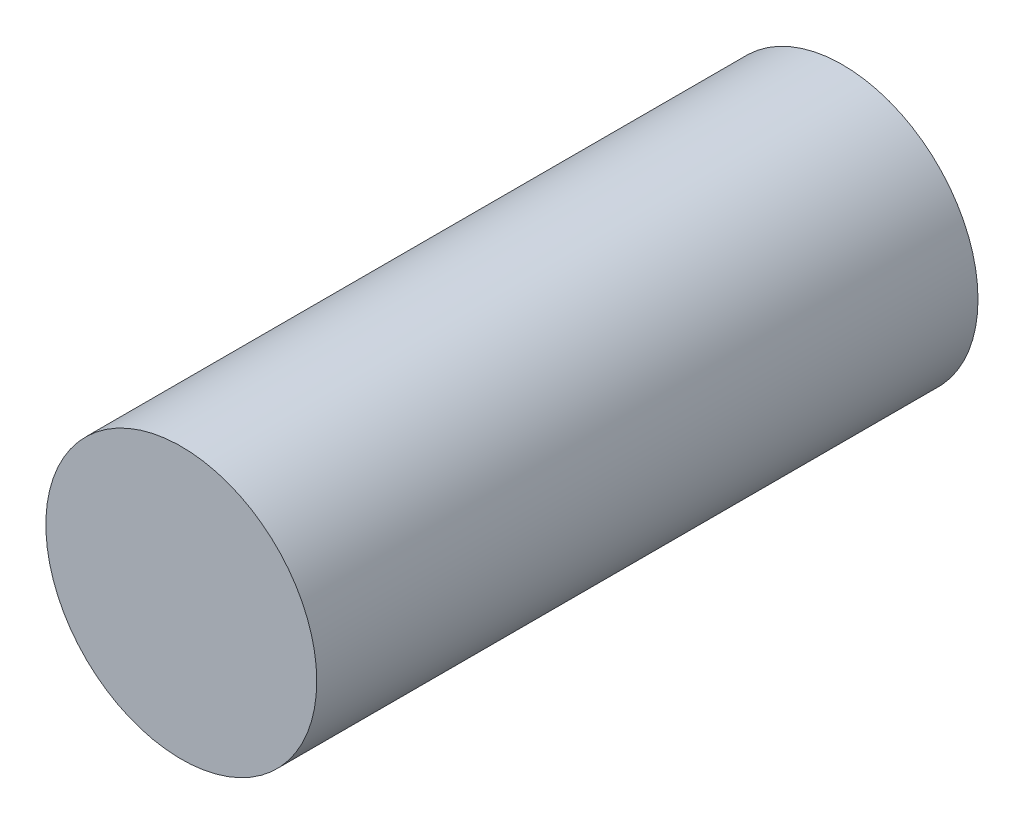
ISO-10303-21;
HEADER;
FILE_DESCRIPTION(('STEP AP214'),'2;1');
FILE_NAME('part.step','',(''),(''),'','','');
FILE_SCHEMA(('AUTOMOTIVE_DESIGN { 1 0 10303 214 1 1 1 1 }'));
ENDSEC;
DATA;
#1=APPLICATION_CONTEXT('core data for automotive mechanical design processes');
#2=APPLICATION_PROTOCOL_DEFINITION('international standard','automotive_design',2000,#1);
#3=PRODUCT_CONTEXT('',#1,'mechanical');
#4=PRODUCT('Part','Part','',(#3));
#5=PRODUCT_RELATED_PRODUCT_CATEGORY('part','',(#4));
#6=PRODUCT_DEFINITION_FORMATION('','',#4);
#7=PRODUCT_DEFINITION_CONTEXT('part definition',#1,'design');
#8=PRODUCT_DEFINITION('design','',#6,#7);
#9=PRODUCT_DEFINITION_SHAPE('','',#8);
#10=(LENGTH_UNIT() NAMED_UNIT(*) SI_UNIT(.MILLI.,.METRE.));
#11=(NAMED_UNIT(*) PLANE_ANGLE_UNIT() SI_UNIT($,.RADIAN.));
#12=(NAMED_UNIT(*) SI_UNIT($,.STERADIAN.) SOLID_ANGLE_UNIT());
#13=UNCERTAINTY_MEASURE_WITH_UNIT(LENGTH_MEASURE(1.E-05),#10,'distance_accuracy_value','');
#14=(GEOMETRIC_REPRESENTATION_CONTEXT(3) GLOBAL_UNCERTAINTY_ASSIGNED_CONTEXT((#13)) GLOBAL_UNIT_ASSIGNED_CONTEXT((#10,
#11,#12)) REPRESENTATION_CONTEXT('',''));
#15=CARTESIAN_POINT('',(0.,0.,0.));
#16=DIRECTION('',(0.,0.,1.));
#17=DIRECTION('',(1.,0.,0.));
#18=AXIS2_PLACEMENT_3D('',#15,#16,#17);
#19=CARTESIAN_POINT('',(0.,0.,5906.114982768));
#20=DIRECTION('',(0.,0.,-1.));
#21=DIRECTION('',(-1.,0.,0.));
#22=AXIS2_PLACEMENT_3D('',#19,#20,#21);
#23=CYLINDRICAL_SURFACE('',#22,1209.806435856);
#24=CARTESIAN_POINT('',(0.,0.,5906.114982768));
#25=DIRECTION('',(0.,0.,1.));
#26=DIRECTION('',(1.,0.,0.));
#27=AXIS2_PLACEMENT_3D('',#24,#25,#26);
#28=CIRCLE('',#27,1209.806435856);
#29=CARTESIAN_POINT('',(1209.806435856,0.,5906.114982768));
#30=VERTEX_POINT('',#29);
#31=EDGE_CURVE('E10',#30,#30,#28,.T.);
#32=ORIENTED_EDGE('',*,*,#31,.F.);
#33=EDGE_LOOP('',(#32));
#34=FACE_BOUND('',#33,.T.);
#35=CARTESIAN_POINT('',(0.,0.,0.));
#36=DIRECTION('',(0.,0.,1.));
#37=DIRECTION('',(1.,0.,0.));
#38=AXIS2_PLACEMENT_3D('',#35,#36,#37);
#39=CIRCLE('',#38,1209.806435856);
#40=CARTESIAN_POINT('',(1209.806435856,0.,0.));
#41=VERTEX_POINT('',#40);
#42=EDGE_CURVE('E37',#41,#41,#39,.T.);
#43=ORIENTED_EDGE('',*,*,#42,.T.);
#44=EDGE_LOOP('',(#43));
#45=FACE_BOUND('',#44,.T.);
#46=ADVANCED_FACE('F34',(#34,#45),#23,.T.);
#47=CARTESIAN_POINT('',(0.,0.,5906.114982768));
#48=DIRECTION('',(0.,0.,1.));
#49=DIRECTION('',(1.,0.,0.));
#50=AXIS2_PLACEMENT_3D('',#47,#48,#49);
#51=PLANE('',#50);
#52=ORIENTED_EDGE('',*,*,#31,.T.);
#53=EDGE_LOOP('',(#52));
#54=FACE_BOUND('',#53,.T.);
#55=ADVANCED_FACE('F49',(#54),#51,.T.);
#56=CARTESIAN_POINT('',(0.,0.,0.));
#57=DIRECTION('',(0.,0.,1.));
#58=DIRECTION('',(1.,0.,0.));
#59=AXIS2_PLACEMENT_3D('',#56,#57,#58);
#60=PLANE('',#59);
#61=ORIENTED_EDGE('',*,*,#42,.F.);
#62=EDGE_LOOP('',(#61));
#63=FACE_BOUND('',#62,.T.);
#64=ADVANCED_FACE('F47',(#63),#60,.F.);
#65=CLOSED_SHELL('',(#46,#55,#64));
#66=MANIFOLD_SOLID_BREP('B2',#65);
#67=ADVANCED_BREP_SHAPE_REPRESENTATION('',(#18,#66),#14);
#68=SHAPE_DEFINITION_REPRESENTATION(#9,#67);
ENDSEC;
END-ISO-10303-21;
